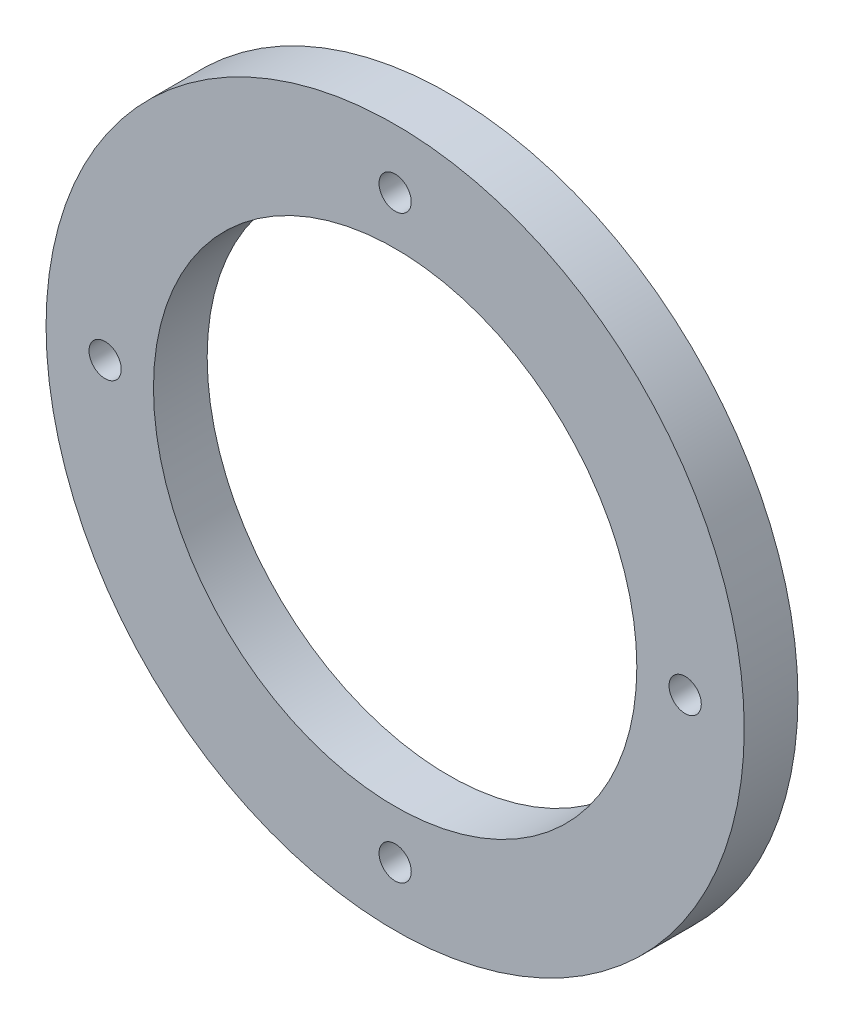
ISO-10303-21;
HEADER;
FILE_DESCRIPTION(('STEP AP214'),'2;1');
FILE_NAME('part.step','',(''),(''),'','','');
FILE_SCHEMA(('AUTOMOTIVE_DESIGN { 1 0 10303 214 1 1 1 1 }'));
ENDSEC;
DATA;
#1=APPLICATION_CONTEXT('core data for automotive mechanical design processes');
#2=APPLICATION_PROTOCOL_DEFINITION('international standard','automotive_design',2000,#1);
#3=PRODUCT_CONTEXT('',#1,'mechanical');
#4=PRODUCT('Part','Part','',(#3));
#5=PRODUCT_RELATED_PRODUCT_CATEGORY('part','',(#4));
#6=PRODUCT_DEFINITION_FORMATION('','',#4);
#7=PRODUCT_DEFINITION_CONTEXT('part definition',#1,'design');
#8=PRODUCT_DEFINITION('design','',#6,#7);
#9=PRODUCT_DEFINITION_SHAPE('','',#8);
#10=(LENGTH_UNIT() NAMED_UNIT(*) SI_UNIT(.MILLI.,.METRE.));
#11=(NAMED_UNIT(*) PLANE_ANGLE_UNIT() SI_UNIT($,.RADIAN.));
#12=(NAMED_UNIT(*) SI_UNIT($,.STERADIAN.) SOLID_ANGLE_UNIT());
#13=UNCERTAINTY_MEASURE_WITH_UNIT(LENGTH_MEASURE(1.E-05),#10,'distance_accuracy_value','');
#14=(GEOMETRIC_REPRESENTATION_CONTEXT(3) GLOBAL_UNCERTAINTY_ASSIGNED_CONTEXT((#13)) GLOBAL_UNIT_ASSIGNED_CONTEXT((#10,
#11,#12)) REPRESENTATION_CONTEXT('',''));
#15=CARTESIAN_POINT('',(0.,0.,0.));
#16=DIRECTION('',(0.,0.,1.));
#17=DIRECTION('',(1.,0.,0.));
#18=AXIS2_PLACEMENT_3D('',#15,#16,#17);
#19=CARTESIAN_POINT('',(0.,0.,5.));
#20=DIRECTION('',(0.,0.,1.));
#21=DIRECTION('',(1.,0.,0.));
#22=AXIS2_PLACEMENT_3D('',#19,#20,#21);
#23=PLANE('',#22);
#24=CARTESIAN_POINT('',(-27.,0.,5.));
#25=DIRECTION('',(0.,0.,1.));
#26=DIRECTION('',(1.,0.,0.));
#27=AXIS2_PLACEMENT_3D('',#24,#25,#26);
#28=CIRCLE('',#27,1.5);
#29=CARTESIAN_POINT('',(-25.5,0.,5.));
#30=VERTEX_POINT('',#29);
#31=EDGE_CURVE('E59',#30,#30,#28,.T.);
#32=ORIENTED_EDGE('',*,*,#31,.F.);
#33=EDGE_LOOP('',(#32));
#34=FACE_BOUND('',#33,.T.);
#35=CARTESIAN_POINT('',(27.,0.,5.));
#36=DIRECTION('',(0.,0.,1.));
#37=DIRECTION('',(1.,0.,0.));
#38=AXIS2_PLACEMENT_3D('',#35,#36,#37);
#39=CIRCLE('',#38,1.5);
#40=CARTESIAN_POINT('',(28.5,0.,5.));
#41=VERTEX_POINT('',#40);
#42=EDGE_CURVE('E47',#41,#41,#39,.T.);
#43=ORIENTED_EDGE('',*,*,#42,.F.);
#44=EDGE_LOOP('',(#43));
#45=FACE_BOUND('',#44,.T.);
#46=CARTESIAN_POINT('',(0.,0.,5.));
#47=DIRECTION('',(0.,0.,1.));
#48=DIRECTION('',(1.,0.,0.));
#49=AXIS2_PLACEMENT_3D('',#46,#47,#48);
#50=CIRCLE('',#49,32.5);
#51=CARTESIAN_POINT('',(32.5,0.,5.));
#52=VERTEX_POINT('',#51);
#53=EDGE_CURVE('E10',#52,#52,#50,.T.);
#54=ORIENTED_EDGE('',*,*,#53,.T.);
#55=EDGE_LOOP('',(#54));
#56=FACE_BOUND('',#55,.T.);
#57=CARTESIAN_POINT('',(0.,0.,5.));
#58=DIRECTION('',(0.,0.,1.));
#59=DIRECTION('',(1.,0.,0.));
#60=AXIS2_PLACEMENT_3D('',#57,#58,#59);
#61=CIRCLE('',#60,22.5);
#62=CARTESIAN_POINT('',(22.5,0.,5.));
#63=VERTEX_POINT('',#62);
#64=EDGE_CURVE('E42',#63,#63,#61,.T.);
#65=ORIENTED_EDGE('',*,*,#64,.F.);
#66=EDGE_LOOP('',(#65));
#67=FACE_BOUND('',#66,.T.);
#68=CARTESIAN_POINT('',(0.,27.,5.));
#69=DIRECTION('',(0.,0.,1.));
#70=DIRECTION('',(1.,0.,0.));
#71=AXIS2_PLACEMENT_3D('',#68,#69,#70);
#72=CIRCLE('',#71,1.5);
#73=CARTESIAN_POINT('',(1.5,27.,5.));
#74=VERTEX_POINT('',#73);
#75=EDGE_CURVE('E53',#74,#74,#72,.T.);
#76=ORIENTED_EDGE('',*,*,#75,.F.);
#77=EDGE_LOOP('',(#76));
#78=FACE_BOUND('',#77,.T.);
#79=CARTESIAN_POINT('',(0.,-27.,5.));
#80=DIRECTION('',(0.,0.,1.));
#81=DIRECTION('',(1.,0.,0.));
#82=AXIS2_PLACEMENT_3D('',#79,#80,#81);
#83=CIRCLE('',#82,1.5);
#84=CARTESIAN_POINT('',(1.5,-27.,5.));
#85=VERTEX_POINT('',#84);
#86=EDGE_CURVE('E65',#85,#85,#83,.T.);
#87=ORIENTED_EDGE('',*,*,#86,.F.);
#88=EDGE_LOOP('',(#87));
#89=FACE_BOUND('',#88,.T.);
#90=ADVANCED_FACE('F31',(#34,#45,#56,#67,#78,#89),#23,.T.);
#91=CARTESIAN_POINT('',(0.,0.,0.));
#92=DIRECTION('',(0.,0.,1.));
#93=DIRECTION('',(1.,0.,0.));
#94=AXIS2_PLACEMENT_3D('',#91,#92,#93);
#95=PLANE('',#94);
#96=CARTESIAN_POINT('',(0.,0.,0.));
#97=DIRECTION('',(0.,0.,1.));
#98=DIRECTION('',(1.,0.,0.));
#99=AXIS2_PLACEMENT_3D('',#96,#97,#98);
#100=CIRCLE('',#99,32.5);
#101=CARTESIAN_POINT('',(32.5,0.,0.));
#102=VERTEX_POINT('',#101);
#103=EDGE_CURVE('E35',#102,#102,#100,.T.);
#104=ORIENTED_EDGE('',*,*,#103,.F.);
#105=EDGE_LOOP('',(#104));
#106=FACE_BOUND('',#105,.T.);
#107=CARTESIAN_POINT('',(0.,0.,0.));
#108=DIRECTION('',(0.,0.,1.));
#109=DIRECTION('',(1.,0.,0.));
#110=AXIS2_PLACEMENT_3D('',#107,#108,#109);
#111=CIRCLE('',#110,22.5);
#112=CARTESIAN_POINT('',(22.5,0.,0.));
#113=VERTEX_POINT('',#112);
#114=EDGE_CURVE('E44',#113,#113,#111,.T.);
#115=ORIENTED_EDGE('',*,*,#114,.T.);
#116=EDGE_LOOP('',(#115));
#117=FACE_BOUND('',#116,.T.);
#118=CARTESIAN_POINT('',(27.,0.,0.));
#119=DIRECTION('',(0.,0.,1.));
#120=DIRECTION('',(1.,0.,0.));
#121=AXIS2_PLACEMENT_3D('',#118,#119,#120);
#122=CIRCLE('',#121,1.5);
#123=CARTESIAN_POINT('',(28.5,0.,0.));
#124=VERTEX_POINT('',#123);
#125=EDGE_CURVE('E50',#124,#124,#122,.T.);
#126=ORIENTED_EDGE('',*,*,#125,.T.);
#127=EDGE_LOOP('',(#126));
#128=FACE_BOUND('',#127,.T.);
#129=CARTESIAN_POINT('',(0.,27.,0.));
#130=DIRECTION('',(0.,0.,1.));
#131=DIRECTION('',(1.,0.,0.));
#132=AXIS2_PLACEMENT_3D('',#129,#130,#131);
#133=CIRCLE('',#132,1.5);
#134=CARTESIAN_POINT('',(1.5,27.,0.));
#135=VERTEX_POINT('',#134);
#136=EDGE_CURVE('E56',#135,#135,#133,.T.);
#137=ORIENTED_EDGE('',*,*,#136,.T.);
#138=EDGE_LOOP('',(#137));
#139=FACE_BOUND('',#138,.T.);
#140=CARTESIAN_POINT('',(-27.,0.,0.));
#141=DIRECTION('',(0.,0.,1.));
#142=DIRECTION('',(1.,0.,0.));
#143=AXIS2_PLACEMENT_3D('',#140,#141,#142);
#144=CIRCLE('',#143,1.5);
#145=CARTESIAN_POINT('',(-25.5,0.,0.));
#146=VERTEX_POINT('',#145);
#147=EDGE_CURVE('E62',#146,#146,#144,.T.);
#148=ORIENTED_EDGE('',*,*,#147,.T.);
#149=EDGE_LOOP('',(#148));
#150=FACE_BOUND('',#149,.T.);
#151=CARTESIAN_POINT('',(0.,-27.,0.));
#152=DIRECTION('',(0.,0.,1.));
#153=DIRECTION('',(1.,0.,0.));
#154=AXIS2_PLACEMENT_3D('',#151,#152,#153);
#155=CIRCLE('',#154,1.5);
#156=CARTESIAN_POINT('',(1.5,-27.,0.));
#157=VERTEX_POINT('',#156);
#158=EDGE_CURVE('E68',#157,#157,#155,.T.);
#159=ORIENTED_EDGE('',*,*,#158,.T.);
#160=EDGE_LOOP('',(#159));
#161=FACE_BOUND('',#160,.T.);
#162=ADVANCED_FACE('F78',(#106,#117,#128,#139,#150,#161),#95,.F.);
#163=CARTESIAN_POINT('',(0.,0.,5.));
#164=DIRECTION('',(0.,0.,-1.));
#165=DIRECTION('',(-1.,0.,0.));
#166=AXIS2_PLACEMENT_3D('',#163,#164,#165);
#167=CYLINDRICAL_SURFACE('',#166,32.5);
#168=ORIENTED_EDGE('',*,*,#53,.F.);
#169=EDGE_LOOP('',(#168));
#170=FACE_BOUND('',#169,.T.);
#171=ORIENTED_EDGE('',*,*,#103,.T.);
#172=EDGE_LOOP('',(#171));
#173=FACE_BOUND('',#172,.T.);
#174=ADVANCED_FACE('F33',(#170,#173),#167,.T.);
#175=CARTESIAN_POINT('',(0.,0.,5.));
#176=DIRECTION('',(0.,0.,-1.));
#177=DIRECTION('',(-1.,0.,0.));
#178=AXIS2_PLACEMENT_3D('',#175,#176,#177);
#179=CYLINDRICAL_SURFACE('',#178,22.5);
#180=ORIENTED_EDGE('',*,*,#64,.T.);
#181=EDGE_LOOP('',(#180));
#182=FACE_BOUND('',#181,.T.);
#183=ORIENTED_EDGE('',*,*,#114,.F.);
#184=EDGE_LOOP('',(#183));
#185=FACE_BOUND('',#184,.T.);
#186=ADVANCED_FACE('F88',(#182,#185),#179,.F.);
#187=CARTESIAN_POINT('',(27.,0.,5.));
#188=DIRECTION('',(0.,0.,-1.));
#189=DIRECTION('',(-1.,0.,0.));
#190=AXIS2_PLACEMENT_3D('',#187,#188,#189);
#191=CYLINDRICAL_SURFACE('',#190,1.5);
#192=ORIENTED_EDGE('',*,*,#42,.T.);
#193=EDGE_LOOP('',(#192));
#194=FACE_BOUND('',#193,.T.);
#195=ORIENTED_EDGE('',*,*,#125,.F.);
#196=EDGE_LOOP('',(#195));
#197=FACE_BOUND('',#196,.T.);
#198=ADVANCED_FACE('F91',(#194,#197),#191,.F.);
#199=CARTESIAN_POINT('',(0.,27.,5.));
#200=DIRECTION('',(0.,0.,-1.));
#201=DIRECTION('',(-1.,0.,0.));
#202=AXIS2_PLACEMENT_3D('',#199,#200,#201);
#203=CYLINDRICAL_SURFACE('',#202,1.5);
#204=ORIENTED_EDGE('',*,*,#75,.T.);
#205=EDGE_LOOP('',(#204));
#206=FACE_BOUND('',#205,.T.);
#207=ORIENTED_EDGE('',*,*,#136,.F.);
#208=EDGE_LOOP('',(#207));
#209=FACE_BOUND('',#208,.T.);
#210=ADVANCED_FACE('F95',(#206,#209),#203,.F.);
#211=CARTESIAN_POINT('',(-27.,0.,5.));
#212=DIRECTION('',(0.,0.,-1.));
#213=DIRECTION('',(-1.,0.,0.));
#214=AXIS2_PLACEMENT_3D('',#211,#212,#213);
#215=CYLINDRICAL_SURFACE('',#214,1.5);
#216=ORIENTED_EDGE('',*,*,#31,.T.);
#217=EDGE_LOOP('',(#216));
#218=FACE_BOUND('',#217,.T.);
#219=ORIENTED_EDGE('',*,*,#147,.F.);
#220=EDGE_LOOP('',(#219));
#221=FACE_BOUND('',#220,.T.);
#222=ADVANCED_FACE('F99',(#218,#221),#215,.F.);
#223=CARTESIAN_POINT('',(0.,-27.,5.));
#224=DIRECTION('',(0.,0.,-1.));
#225=DIRECTION('',(-1.,0.,0.));
#226=AXIS2_PLACEMENT_3D('',#223,#224,#225);
#227=CYLINDRICAL_SURFACE('',#226,1.5);
#228=ORIENTED_EDGE('',*,*,#86,.T.);
#229=EDGE_LOOP('',(#228));
#230=FACE_BOUND('',#229,.T.);
#231=ORIENTED_EDGE('',*,*,#158,.F.);
#232=EDGE_LOOP('',(#231));
#233=FACE_BOUND('',#232,.T.);
#234=ADVANCED_FACE('F74',(#230,#233),#227,.F.);
#235=CLOSED_SHELL('',(#90,#162,#174,#186,#198,#210,#222,#234));
#236=MANIFOLD_SOLID_BREP('B2',#235);
#237=ADVANCED_BREP_SHAPE_REPRESENTATION('',(#18,#236),#14);
#238=SHAPE_DEFINITION_REPRESENTATION(#9,#237);
ENDSEC;
END-ISO-10303-21;
